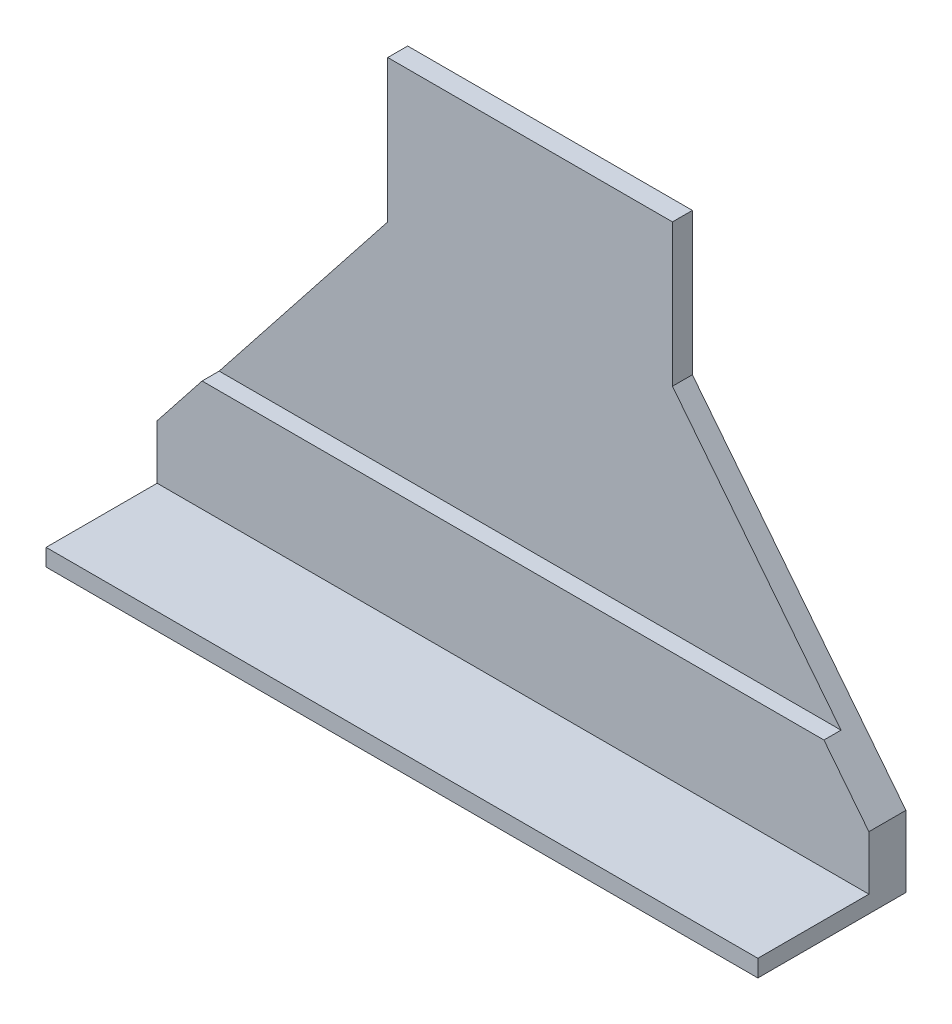
ISO-10303-21;
HEADER;
FILE_DESCRIPTION(('STEP AP214'),'2;1');
FILE_NAME('part.step','',(''),(''),'','','');
FILE_SCHEMA(('AUTOMOTIVE_DESIGN { 1 0 10303 214 1 1 1 1 }'));
ENDSEC;
DATA;
#1=APPLICATION_CONTEXT('core data for automotive mechanical design processes');
#2=APPLICATION_PROTOCOL_DEFINITION('international standard','automotive_design',2000,#1);
#3=PRODUCT_CONTEXT('',#1,'mechanical');
#4=PRODUCT('Part','Part','',(#3));
#5=PRODUCT_RELATED_PRODUCT_CATEGORY('part','',(#4));
#6=PRODUCT_DEFINITION_FORMATION('','',#4);
#7=PRODUCT_DEFINITION_CONTEXT('part definition',#1,'design');
#8=PRODUCT_DEFINITION('design','',#6,#7);
#9=PRODUCT_DEFINITION_SHAPE('','',#8);
#10=(LENGTH_UNIT() NAMED_UNIT(*) SI_UNIT(.MILLI.,.METRE.));
#11=(NAMED_UNIT(*) PLANE_ANGLE_UNIT() SI_UNIT($,.RADIAN.));
#12=(NAMED_UNIT(*) SI_UNIT($,.STERADIAN.) SOLID_ANGLE_UNIT());
#13=UNCERTAINTY_MEASURE_WITH_UNIT(LENGTH_MEASURE(1.E-05),#10,'distance_accuracy_value','');
#14=(GEOMETRIC_REPRESENTATION_CONTEXT(3) GLOBAL_UNCERTAINTY_ASSIGNED_CONTEXT((#13)) GLOBAL_UNIT_ASSIGNED_CONTEXT((#10,
#11,#12)) REPRESENTATION_CONTEXT('',''));
#15=CARTESIAN_POINT('',(0.,0.,0.));
#16=DIRECTION('',(0.,0.,1.));
#17=DIRECTION('',(1.,0.,0.));
#18=AXIS2_PLACEMENT_3D('',#15,#16,#17);
#19=CARTESIAN_POINT('',(0.,0.,14.));
#20=DIRECTION('',(0.,1.,0.));
#21=DIRECTION('',(0.,0.,1.));
#22=AXIS2_PLACEMENT_3D('',#19,#20,#21);
#23=PLANE('',#22);
#24=DIRECTION('',(1.,0.,0.));
#25=VECTOR('',#24,1.);
#26=CARTESIAN_POINT('',(0.,0.,0.));
#27=LINE('',#26,#25);
#28=CARTESIAN_POINT('',(-250.,0.,0.));
#29=VERTEX_POINT('',#28);
#30=CARTESIAN_POINT('',(250.,0.,0.));
#31=VERTEX_POINT('',#30);
#32=EDGE_CURVE('E224',#29,#31,#27,.T.);
#33=ORIENTED_EDGE('',*,*,#32,.T.);
#34=DIRECTION('',(0.,0.,-1.));
#35=VECTOR('',#34,1.);
#36=CARTESIAN_POINT('',(250.,0.,14.));
#37=LINE('',#36,#35);
#38=CARTESIAN_POINT('',(250.,0.,104.));
#39=VERTEX_POINT('',#38);
#40=EDGE_CURVE('E142',#39,#31,#37,.T.);
#41=ORIENTED_EDGE('',*,*,#40,.F.);
#42=DIRECTION('',(1.,0.,0.));
#43=VECTOR('',#42,1.);
#44=CARTESIAN_POINT('',(-250.,0.,104.));
#45=LINE('',#44,#43);
#46=CARTESIAN_POINT('',(-250.,0.,104.));
#47=VERTEX_POINT('',#46);
#48=EDGE_CURVE('E145',#47,#39,#45,.T.);
#49=ORIENTED_EDGE('',*,*,#48,.F.);
#50=DIRECTION('',(0.,0.,-1.));
#51=VECTOR('',#50,1.);
#52=CARTESIAN_POINT('',(-250.,0.,14.));
#53=LINE('',#52,#51);
#54=EDGE_CURVE('E129',#47,#29,#53,.T.);
#55=ORIENTED_EDGE('',*,*,#54,.T.);
#56=EDGE_LOOP('',(#33,#41,#49,#55));
#57=FACE_BOUND('',#56,.T.);
#58=ADVANCED_FACE('F36',(#57),#23,.F.);
#59=CARTESIAN_POINT('',(-250.,12.,104.));
#60=DIRECTION('',(0.,-1.,0.));
#61=DIRECTION('',(0.,0.,-1.));
#62=AXIS2_PLACEMENT_3D('',#59,#60,#61);
#63=PLANE('',#62);
#64=DIRECTION('',(-1.,0.,0.));
#65=VECTOR('',#64,1.);
#66=CARTESIAN_POINT('',(-250.,12.,26.));
#67=LINE('',#66,#65);
#68=CARTESIAN_POINT('',(250.,12.,26.));
#69=VERTEX_POINT('',#68);
#70=CARTESIAN_POINT('',(-250.,12.,26.));
#71=VERTEX_POINT('',#70);
#72=EDGE_CURVE('E53',#69,#71,#67,.T.);
#73=ORIENTED_EDGE('',*,*,#72,.T.);
#74=DIRECTION('',(0.,0.,-1.));
#75=VECTOR('',#74,1.);
#76=CARTESIAN_POINT('',(-250.,12.,104.));
#77=LINE('',#76,#75);
#78=CARTESIAN_POINT('',(-250.,12.,104.));
#79=VERTEX_POINT('',#78);
#80=EDGE_CURVE('E159',#79,#71,#77,.T.);
#81=ORIENTED_EDGE('',*,*,#80,.F.);
#82=DIRECTION('',(-1.,0.,0.));
#83=VECTOR('',#82,1.);
#84=CARTESIAN_POINT('',(-250.,12.,104.));
#85=LINE('',#84,#83);
#86=CARTESIAN_POINT('',(250.,12.,104.));
#87=VERTEX_POINT('',#86);
#88=EDGE_CURVE('E152',#87,#79,#85,.T.);
#89=ORIENTED_EDGE('',*,*,#88,.F.);
#90=DIRECTION('',(0.,0.,-1.));
#91=VECTOR('',#90,1.);
#92=CARTESIAN_POINT('',(250.,12.,104.));
#93=LINE('',#92,#91);
#94=EDGE_CURVE('E170',#87,#69,#93,.T.);
#95=ORIENTED_EDGE('',*,*,#94,.T.);
#96=EDGE_LOOP('',(#73,#81,#89,#95));
#97=FACE_BOUND('',#96,.T.);
#98=ADVANCED_FACE('F271',(#97),#63,.F.);
#99=CARTESIAN_POINT('',(-100.,340.,0.));
#100=DIRECTION('',(0.,0.,1.));
#101=DIRECTION('',(1.,0.,0.));
#102=AXIS2_PLACEMENT_3D('',#99,#100,#101);
#103=PLANE('',#102);
#104=ORIENTED_EDGE('',*,*,#32,.F.);
#105=DIRECTION('',(0.,-1.,0.));
#106=VECTOR('',#105,1.);
#107=CARTESIAN_POINT('',(-250.,0.,0.));
#108=LINE('',#107,#106);
#109=CARTESIAN_POINT('',(-250.,50.,0.));
#110=VERTEX_POINT('',#109);
#111=EDGE_CURVE('E137',#110,#29,#108,.T.);
#112=ORIENTED_EDGE('',*,*,#111,.F.);
#113=DIRECTION('',(-0.619644288579021,-0.784882765533426,0.));
#114=VECTOR('',#113,1.);
#115=CARTESIAN_POINT('',(-100.,240.,0.));
#116=LINE('',#115,#114);
#117=CARTESIAN_POINT('',(-100.,240.,0.));
#118=VERTEX_POINT('',#117);
#119=EDGE_CURVE('E227',#118,#110,#116,.T.);
#120=ORIENTED_EDGE('',*,*,#119,.F.);
#121=DIRECTION('',(0.,-1.,0.));
#122=VECTOR('',#121,1.);
#123=CARTESIAN_POINT('',(-100.,340.,0.));
#124=LINE('',#123,#122);
#125=CARTESIAN_POINT('',(-100.,340.,0.));
#126=VERTEX_POINT('',#125);
#127=EDGE_CURVE('E229',#126,#118,#124,.T.);
#128=ORIENTED_EDGE('',*,*,#127,.F.);
#129=DIRECTION('',(-1.,0.,0.));
#130=VECTOR('',#129,1.);
#131=CARTESIAN_POINT('',(0.,340.,0.));
#132=LINE('',#131,#130);
#133=CARTESIAN_POINT('',(100.,340.,0.));
#134=VERTEX_POINT('',#133);
#135=EDGE_CURVE('E196',#134,#126,#132,.T.);
#136=ORIENTED_EDGE('',*,*,#135,.F.);
#137=DIRECTION('',(0.,1.,0.));
#138=VECTOR('',#137,1.);
#139=CARTESIAN_POINT('',(100.,340.,0.));
#140=LINE('',#139,#138);
#141=CARTESIAN_POINT('',(100.,240.,0.));
#142=VERTEX_POINT('',#141);
#143=EDGE_CURVE('E218',#142,#134,#140,.T.);
#144=ORIENTED_EDGE('',*,*,#143,.F.);
#145=DIRECTION('',(-0.619644288579021,0.784882765533426,0.));
#146=VECTOR('',#145,1.);
#147=CARTESIAN_POINT('',(100.,240.,0.));
#148=LINE('',#147,#146);
#149=CARTESIAN_POINT('',(250.,50.,0.));
#150=VERTEX_POINT('',#149);
#151=EDGE_CURVE('E220',#150,#142,#148,.T.);
#152=ORIENTED_EDGE('',*,*,#151,.F.);
#153=DIRECTION('',(0.,1.,0.));
#154=VECTOR('',#153,1.);
#155=CARTESIAN_POINT('',(250.,0.,0.));
#156=LINE('',#155,#154);
#157=EDGE_CURVE('E222',#31,#150,#156,.T.);
#158=ORIENTED_EDGE('',*,*,#157,.F.);
#159=EDGE_LOOP('',(#104,#112,#120,#128,#136,#144,#152,#158));
#160=FACE_BOUND('',#159,.T.);
#161=ADVANCED_FACE('F248',(#160),#103,.F.);
#162=CARTESIAN_POINT('',(0.,0.,26.));
#163=DIRECTION('',(0.,0.,1.));
#164=DIRECTION('',(1.,0.,0.));
#165=AXIS2_PLACEMENT_3D('',#162,#163,#164);
#166=PLANE('',#165);
#167=ORIENTED_EDGE('',*,*,#72,.F.);
#168=DIRECTION('',(0.,1.,0.));
#169=VECTOR('',#168,1.);
#170=CARTESIAN_POINT('',(250.,0.,26.));
#171=LINE('',#170,#169);
#172=CARTESIAN_POINT('',(250.,49.9999999999999,26.));
#173=VERTEX_POINT('',#172);
#174=EDGE_CURVE('E166',#69,#173,#171,.T.);
#175=ORIENTED_EDGE('',*,*,#174,.T.);
#176=DIRECTION('',(-0.619644288579021,0.784882765533426,0.));
#177=VECTOR('',#176,1.);
#178=CARTESIAN_POINT('',(178.327645051195,140.784982935154,26.));
#179=LINE('',#178,#177);
#180=CARTESIAN_POINT('',(218.421052631579,90.,26.));
#181=VERTEX_POINT('',#180);
#182=EDGE_CURVE('E191',#173,#181,#179,.T.);
#183=ORIENTED_EDGE('',*,*,#182,.T.);
#184=DIRECTION('',(1.,0.,0.));
#185=VECTOR('',#184,1.);
#186=CARTESIAN_POINT('',(0.,90.,26.));
#187=LINE('',#186,#185);
#188=CARTESIAN_POINT('',(-218.421052631579,90.,26.));
#189=VERTEX_POINT('',#188);
#190=EDGE_CURVE('E162',#189,#181,#187,.T.);
#191=ORIENTED_EDGE('',*,*,#190,.F.);
#192=DIRECTION('',(-0.619644288579021,-0.784882765533426,0.));
#193=VECTOR('',#192,1.);
#194=CARTESIAN_POINT('',(-178.327645051195,140.784982935154,26.));
#195=LINE('',#194,#193);
#196=CARTESIAN_POINT('',(-250.,50.,26.));
#197=VERTEX_POINT('',#196);
#198=EDGE_CURVE('E180',#189,#197,#195,.T.);
#199=ORIENTED_EDGE('',*,*,#198,.T.);
#200=DIRECTION('',(0.,-1.,0.));
#201=VECTOR('',#200,1.);
#202=CARTESIAN_POINT('',(-250.,0.,26.));
#203=LINE('',#202,#201);
#204=EDGE_CURVE('E306',#197,#71,#203,.T.);
#205=ORIENTED_EDGE('',*,*,#204,.T.);
#206=EDGE_LOOP('',(#167,#175,#183,#191,#199,#205));
#207=FACE_BOUND('',#206,.T.);
#208=ADVANCED_FACE('F289',(#207),#166,.T.);
#209=CARTESIAN_POINT('',(-100.,340.,14.));
#210=DIRECTION('',(0.,0.,1.));
#211=DIRECTION('',(1.,0.,0.));
#212=AXIS2_PLACEMENT_3D('',#209,#210,#211);
#213=PLANE('',#212);
#214=DIRECTION('',(-0.619644288579021,-0.784882765533426,0.));
#215=VECTOR('',#214,1.);
#216=CARTESIAN_POINT('',(-100.,240.,14.));
#217=LINE('',#216,#215);
#218=CARTESIAN_POINT('',(-100.,240.,14.));
#219=VERTEX_POINT('',#218);
#220=CARTESIAN_POINT('',(-218.421052631579,90.,14.));
#221=VERTEX_POINT('',#220);
#222=EDGE_CURVE('E198',#219,#221,#217,.T.);
#223=ORIENTED_EDGE('',*,*,#222,.T.);
#224=DIRECTION('',(1.,0.,0.));
#225=VECTOR('',#224,1.);
#226=CARTESIAN_POINT('',(0.,90.,14.));
#227=LINE('',#226,#225);
#228=CARTESIAN_POINT('',(218.421052631579,89.9999999999999,14.));
#229=VERTEX_POINT('',#228);
#230=EDGE_CURVE('E173',#221,#229,#227,.T.);
#231=ORIENTED_EDGE('',*,*,#230,.T.);
#232=DIRECTION('',(-0.619644288579021,0.784882765533426,0.));
#233=VECTOR('',#232,1.);
#234=CARTESIAN_POINT('',(100.,240.,14.));
#235=LINE('',#234,#233);
#236=CARTESIAN_POINT('',(100.,240.,14.));
#237=VERTEX_POINT('',#236);
#238=EDGE_CURVE('E184',#229,#237,#235,.T.);
#239=ORIENTED_EDGE('',*,*,#238,.T.);
#240=DIRECTION('',(0.,1.,0.));
#241=VECTOR('',#240,1.);
#242=CARTESIAN_POINT('',(100.,340.,14.));
#243=LINE('',#242,#241);
#244=CARTESIAN_POINT('',(100.,340.,14.));
#245=VERTEX_POINT('',#244);
#246=EDGE_CURVE('E216',#237,#245,#243,.T.);
#247=ORIENTED_EDGE('',*,*,#246,.T.);
#248=DIRECTION('',(-1.,0.,0.));
#249=VECTOR('',#248,1.);
#250=CARTESIAN_POINT('',(0.,340.,14.));
#251=LINE('',#250,#249);
#252=CARTESIAN_POINT('',(-100.,340.,14.));
#253=VERTEX_POINT('',#252);
#254=EDGE_CURVE('E192',#245,#253,#251,.T.);
#255=ORIENTED_EDGE('',*,*,#254,.T.);
#256=DIRECTION('',(0.,-1.,0.));
#257=VECTOR('',#256,1.);
#258=CARTESIAN_POINT('',(-100.,340.,14.));
#259=LINE('',#258,#257);
#260=EDGE_CURVE('E195',#253,#219,#259,.T.);
#261=ORIENTED_EDGE('',*,*,#260,.T.);
#262=EDGE_LOOP('',(#223,#231,#239,#247,#255,#261));
#263=FACE_BOUND('',#262,.T.);
#264=ADVANCED_FACE('F235',(#263),#213,.T.);
#265=CARTESIAN_POINT('',(-100.,340.,14.));
#266=DIRECTION('',(1.,0.,0.));
#267=DIRECTION('',(0.,1.,0.));
#268=AXIS2_PLACEMENT_3D('',#265,#266,#267);
#269=PLANE('',#268);
#270=ORIENTED_EDGE('',*,*,#127,.T.);
#271=DIRECTION('',(0.,0.,-1.));
#272=VECTOR('',#271,1.);
#273=CARTESIAN_POINT('',(-100.,240.,14.));
#274=LINE('',#273,#272);
#275=EDGE_CURVE('E45',#219,#118,#274,.T.);
#276=ORIENTED_EDGE('',*,*,#275,.F.);
#277=ORIENTED_EDGE('',*,*,#260,.F.);
#278=DIRECTION('',(0.,0.,-1.));
#279=VECTOR('',#278,1.);
#280=CARTESIAN_POINT('',(-100.,340.,14.));
#281=LINE('',#280,#279);
#282=EDGE_CURVE('E11',#253,#126,#281,.T.);
#283=ORIENTED_EDGE('',*,*,#282,.T.);
#284=EDGE_LOOP('',(#270,#276,#277,#283));
#285=FACE_BOUND('',#284,.T.);
#286=ADVANCED_FACE('F38',(#285),#269,.F.);
#287=CARTESIAN_POINT('',(-100.,240.,14.));
#288=DIRECTION('',(0.784882765533426,-0.619644288579021,0.));
#289=DIRECTION('',(0.619644288579021,0.784882765533426,0.));
#290=AXIS2_PLACEMENT_3D('',#287,#288,#289);
#291=PLANE('',#290);
#292=ORIENTED_EDGE('',*,*,#119,.T.);
#293=DIRECTION('',(0.,0.,-1.));
#294=VECTOR('',#293,1.);
#295=CARTESIAN_POINT('',(-250.,50.,14.));
#296=LINE('',#295,#294);
#297=EDGE_CURVE('E141',#197,#110,#296,.T.);
#298=ORIENTED_EDGE('',*,*,#297,.F.);
#299=ORIENTED_EDGE('',*,*,#198,.F.);
#300=DIRECTION('',(0.,0.,-1.));
#301=VECTOR('',#300,1.);
#302=CARTESIAN_POINT('',(-218.421052631579,90.,26.));
#303=LINE('',#302,#301);
#304=EDGE_CURVE('E230',#189,#221,#303,.T.);
#305=ORIENTED_EDGE('',*,*,#304,.T.);
#306=ORIENTED_EDGE('',*,*,#222,.F.);
#307=ORIENTED_EDGE('',*,*,#275,.T.);
#308=EDGE_LOOP('',(#292,#298,#299,#305,#306,#307));
#309=FACE_BOUND('',#308,.T.);
#310=ADVANCED_FACE('F254',(#309),#291,.F.);
#311=CARTESIAN_POINT('',(-250.,0.,14.));
#312=DIRECTION('',(1.,0.,0.));
#313=DIRECTION('',(0.,0.,-1.));
#314=AXIS2_PLACEMENT_3D('',#311,#312,#313);
#315=PLANE('',#314);
#316=ORIENTED_EDGE('',*,*,#111,.T.);
#317=ORIENTED_EDGE('',*,*,#54,.F.);
#318=DIRECTION('',(0.,-1.,0.));
#319=VECTOR('',#318,1.);
#320=CARTESIAN_POINT('',(-250.,0.,104.));
#321=LINE('',#320,#319);
#322=EDGE_CURVE('E134',#79,#47,#321,.T.);
#323=ORIENTED_EDGE('',*,*,#322,.F.);
#324=ORIENTED_EDGE('',*,*,#80,.T.);
#325=ORIENTED_EDGE('',*,*,#204,.F.);
#326=ORIENTED_EDGE('',*,*,#297,.T.);
#327=EDGE_LOOP('',(#316,#317,#323,#324,#325,#326));
#328=FACE_BOUND('',#327,.T.);
#329=ADVANCED_FACE('F131',(#328),#315,.F.);
#330=CARTESIAN_POINT('',(250.,0.,14.));
#331=DIRECTION('',(-1.,0.,0.));
#332=DIRECTION('',(0.,0.,1.));
#333=AXIS2_PLACEMENT_3D('',#330,#331,#332);
#334=PLANE('',#333);
#335=ORIENTED_EDGE('',*,*,#174,.F.);
#336=ORIENTED_EDGE('',*,*,#94,.F.);
#337=DIRECTION('',(0.,1.,0.));
#338=VECTOR('',#337,1.);
#339=CARTESIAN_POINT('',(250.,0.,104.));
#340=LINE('',#339,#338);
#341=EDGE_CURVE('E148',#39,#87,#340,.T.);
#342=ORIENTED_EDGE('',*,*,#341,.F.);
#343=ORIENTED_EDGE('',*,*,#40,.T.);
#344=ORIENTED_EDGE('',*,*,#157,.T.);
#345=DIRECTION('',(0.,0.,-1.));
#346=VECTOR('',#345,1.);
#347=CARTESIAN_POINT('',(250.,50.,14.));
#348=LINE('',#347,#346);
#349=EDGE_CURVE('E207',#173,#150,#348,.T.);
#350=ORIENTED_EDGE('',*,*,#349,.F.);
#351=EDGE_LOOP('',(#335,#336,#342,#343,#344,#350));
#352=FACE_BOUND('',#351,.T.);
#353=ADVANCED_FACE('F279',(#352),#334,.F.);
#354=CARTESIAN_POINT('',(100.,240.,14.));
#355=DIRECTION('',(-0.784882765533426,-0.619644288579021,0.));
#356=DIRECTION('',(0.619644288579021,-0.784882765533426,0.));
#357=AXIS2_PLACEMENT_3D('',#354,#355,#356);
#358=PLANE('',#357);
#359=ORIENTED_EDGE('',*,*,#238,.F.);
#360=DIRECTION('',(0.,0.,-1.));
#361=VECTOR('',#360,1.);
#362=CARTESIAN_POINT('',(218.421052631579,90.,26.));
#363=LINE('',#362,#361);
#364=EDGE_CURVE('E61',#181,#229,#363,.T.);
#365=ORIENTED_EDGE('',*,*,#364,.F.);
#366=ORIENTED_EDGE('',*,*,#182,.F.);
#367=ORIENTED_EDGE('',*,*,#349,.T.);
#368=ORIENTED_EDGE('',*,*,#151,.T.);
#369=DIRECTION('',(0.,0.,-1.));
#370=VECTOR('',#369,1.);
#371=CARTESIAN_POINT('',(100.,240.,14.));
#372=LINE('',#371,#370);
#373=EDGE_CURVE('E210',#237,#142,#372,.T.);
#374=ORIENTED_EDGE('',*,*,#373,.F.);
#375=EDGE_LOOP('',(#359,#365,#366,#367,#368,#374));
#376=FACE_BOUND('',#375,.T.);
#377=ADVANCED_FACE('F237',(#376),#358,.F.);
#378=CARTESIAN_POINT('',(100.,340.,14.));
#379=DIRECTION('',(-1.,0.,0.));
#380=DIRECTION('',(0.,0.,1.));
#381=AXIS2_PLACEMENT_3D('',#378,#379,#380);
#382=PLANE('',#381);
#383=ORIENTED_EDGE('',*,*,#143,.T.);
#384=DIRECTION('',(0.,0.,-1.));
#385=VECTOR('',#384,1.);
#386=CARTESIAN_POINT('',(100.,340.,14.));
#387=LINE('',#386,#385);
#388=EDGE_CURVE('E213',#245,#134,#387,.T.);
#389=ORIENTED_EDGE('',*,*,#388,.F.);
#390=ORIENTED_EDGE('',*,*,#246,.F.);
#391=ORIENTED_EDGE('',*,*,#373,.T.);
#392=EDGE_LOOP('',(#383,#389,#390,#391));
#393=FACE_BOUND('',#392,.T.);
#394=ADVANCED_FACE('F241',(#393),#382,.F.);
#395=CARTESIAN_POINT('',(0.,340.,14.));
#396=DIRECTION('',(0.,-1.,0.));
#397=DIRECTION('',(0.,0.,-1.));
#398=AXIS2_PLACEMENT_3D('',#395,#396,#397);
#399=PLANE('',#398);
#400=ORIENTED_EDGE('',*,*,#135,.T.);
#401=ORIENTED_EDGE('',*,*,#282,.F.);
#402=ORIENTED_EDGE('',*,*,#254,.F.);
#403=ORIENTED_EDGE('',*,*,#388,.T.);
#404=EDGE_LOOP('',(#400,#401,#402,#403));
#405=FACE_BOUND('',#404,.T.);
#406=ADVANCED_FACE('F244',(#405),#399,.F.);
#407=CARTESIAN_POINT('',(0.,90.,26.));
#408=DIRECTION('',(0.,1.,0.));
#409=DIRECTION('',(0.,0.,1.));
#410=AXIS2_PLACEMENT_3D('',#407,#408,#409);
#411=PLANE('',#410);
#412=ORIENTED_EDGE('',*,*,#230,.F.);
#413=ORIENTED_EDGE('',*,*,#304,.F.);
#414=ORIENTED_EDGE('',*,*,#190,.T.);
#415=ORIENTED_EDGE('',*,*,#364,.T.);
#416=EDGE_LOOP('',(#412,#413,#414,#415));
#417=FACE_BOUND('',#416,.T.);
#418=ADVANCED_FACE('F259',(#417),#411,.T.);
#419=CARTESIAN_POINT('',(-250.,12.,104.));
#420=DIRECTION('',(0.,0.,-1.));
#421=DIRECTION('',(-1.,0.,0.));
#422=AXIS2_PLACEMENT_3D('',#419,#420,#421);
#423=PLANE('',#422);
#424=ORIENTED_EDGE('',*,*,#322,.T.);
#425=ORIENTED_EDGE('',*,*,#48,.T.);
#426=ORIENTED_EDGE('',*,*,#341,.T.);
#427=ORIENTED_EDGE('',*,*,#88,.T.);
#428=EDGE_LOOP('',(#424,#425,#426,#427));
#429=FACE_BOUND('',#428,.T.);
#430=ADVANCED_FACE('F150',(#429),#423,.F.);
#431=CLOSED_SHELL('',(#58,#98,#161,#208,#264,#286,#310,#329,#353,#377,#394,#406,#418,#430));
#432=MANIFOLD_SOLID_BREP('B2',#431);
#433=ADVANCED_BREP_SHAPE_REPRESENTATION('',(#18,#432),#14);
#434=SHAPE_DEFINITION_REPRESENTATION(#9,#433);
ENDSEC;
END-ISO-10303-21;
